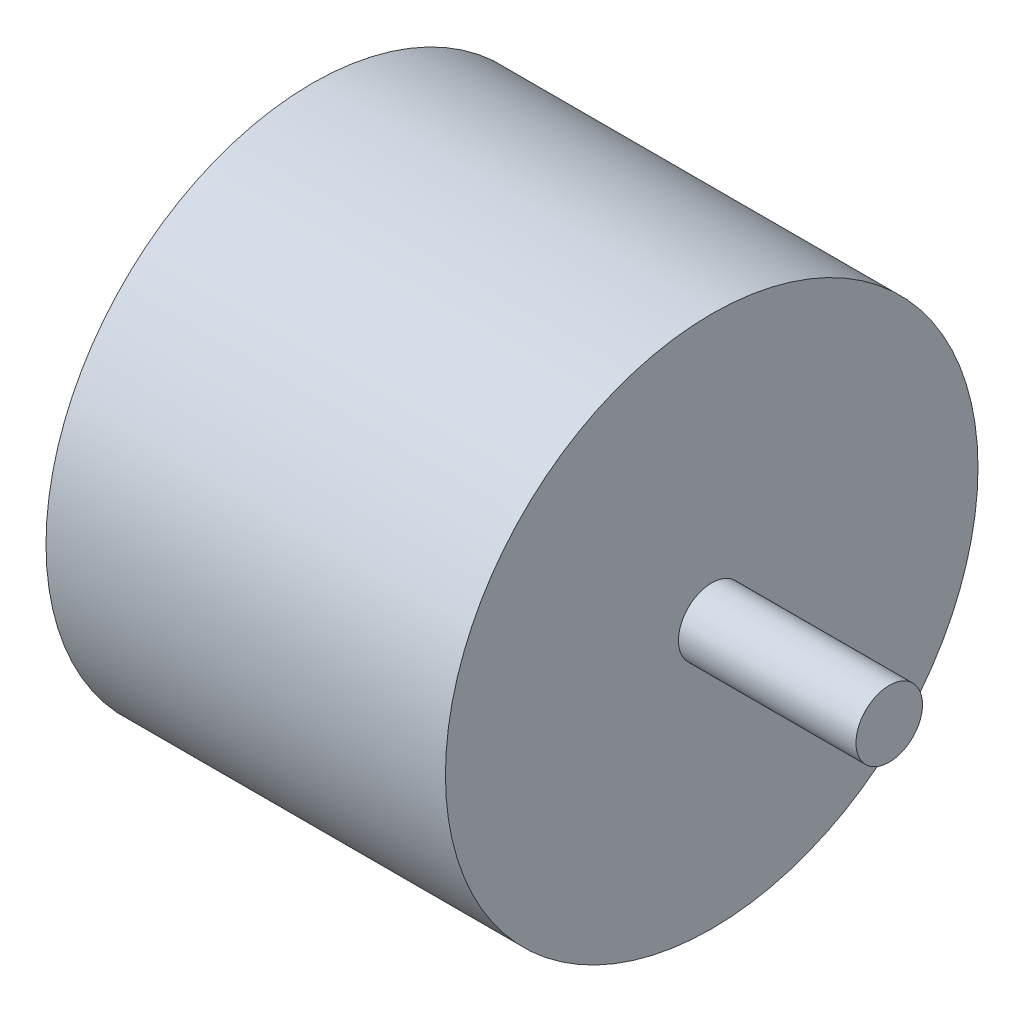
ISO-10303-21;
HEADER;
FILE_DESCRIPTION(('STEP AP214'),'2;1');
FILE_NAME('part.step','',(''),(''),'','','');
FILE_SCHEMA(('AUTOMOTIVE_DESIGN { 1 0 10303 214 1 1 1 1 }'));
ENDSEC;
DATA;
#1=APPLICATION_CONTEXT('core data for automotive mechanical design processes');
#2=APPLICATION_PROTOCOL_DEFINITION('international standard','automotive_design',2000,#1);
#3=PRODUCT_CONTEXT('',#1,'mechanical');
#4=PRODUCT('Part','Part','',(#3));
#5=PRODUCT_RELATED_PRODUCT_CATEGORY('part','',(#4));
#6=PRODUCT_DEFINITION_FORMATION('','',#4);
#7=PRODUCT_DEFINITION_CONTEXT('part definition',#1,'design');
#8=PRODUCT_DEFINITION('design','',#6,#7);
#9=PRODUCT_DEFINITION_SHAPE('','',#8);
#10=(LENGTH_UNIT() NAMED_UNIT(*) SI_UNIT(.MILLI.,.METRE.));
#11=(NAMED_UNIT(*) PLANE_ANGLE_UNIT() SI_UNIT($,.RADIAN.));
#12=(NAMED_UNIT(*) SI_UNIT($,.STERADIAN.) SOLID_ANGLE_UNIT());
#13=UNCERTAINTY_MEASURE_WITH_UNIT(LENGTH_MEASURE(1.E-05),#10,'distance_accuracy_value','');
#14=(GEOMETRIC_REPRESENTATION_CONTEXT(3) GLOBAL_UNCERTAINTY_ASSIGNED_CONTEXT((#13)) GLOBAL_UNIT_ASSIGNED_CONTEXT((#10,
#11,#12)) REPRESENTATION_CONTEXT('',''));
#15=CARTESIAN_POINT('',(0.,0.,0.));
#16=DIRECTION('',(0.,0.,1.));
#17=DIRECTION('',(1.,0.,0.));
#18=AXIS2_PLACEMENT_3D('',#15,#16,#17);
#19=CARTESIAN_POINT('',(18.,0.,0.));
#20=DIRECTION('',(-1.,0.,0.));
#21=DIRECTION('',(0.,0.,1.));
#22=AXIS2_PLACEMENT_3D('',#19,#20,#21);
#23=CYLINDRICAL_SURFACE('',#22,12.);
#24=CARTESIAN_POINT('',(18.,0.,0.));
#25=DIRECTION('',(1.,0.,0.));
#26=DIRECTION('',(0.,0.,-1.));
#27=AXIS2_PLACEMENT_3D('',#24,#25,#26);
#28=CIRCLE('',#27,12.);
#29=CARTESIAN_POINT('',(18.,0.,-12.));
#30=VERTEX_POINT('',#29);
#31=EDGE_CURVE('E10',#30,#30,#28,.T.);
#32=ORIENTED_EDGE('',*,*,#31,.F.);
#33=EDGE_LOOP('',(#32));
#34=FACE_BOUND('',#33,.T.);
#35=CARTESIAN_POINT('',(0.,0.,0.));
#36=DIRECTION('',(1.,0.,0.));
#37=DIRECTION('',(0.,0.,-1.));
#38=AXIS2_PLACEMENT_3D('',#35,#36,#37);
#39=CIRCLE('',#38,12.);
#40=CARTESIAN_POINT('',(0.,0.,-12.));
#41=VERTEX_POINT('',#40);
#42=EDGE_CURVE('E36',#41,#41,#39,.T.);
#43=ORIENTED_EDGE('',*,*,#42,.T.);
#44=EDGE_LOOP('',(#43));
#45=FACE_BOUND('',#44,.T.);
#46=ADVANCED_FACE('F33',(#34,#45),#23,.T.);
#47=CARTESIAN_POINT('',(18.,0.,0.));
#48=DIRECTION('',(1.,0.,0.));
#49=DIRECTION('',(0.,0.,-1.));
#50=AXIS2_PLACEMENT_3D('',#47,#48,#49);
#51=PLANE('',#50);
#52=CARTESIAN_POINT('',(18.,0.,0.));
#53=DIRECTION('',(1.,0.,0.));
#54=DIRECTION('',(0.,0.,-1.));
#55=AXIS2_PLACEMENT_3D('',#52,#53,#54);
#56=CIRCLE('',#55,1.5);
#57=CARTESIAN_POINT('',(18.,0.,-1.5));
#58=VERTEX_POINT('',#57);
#59=EDGE_CURVE('E45',#58,#58,#56,.T.);
#60=ORIENTED_EDGE('',*,*,#59,.F.);
#61=EDGE_LOOP('',(#60));
#62=FACE_BOUND('',#61,.T.);
#63=ORIENTED_EDGE('',*,*,#31,.T.);
#64=EDGE_LOOP('',(#63));
#65=FACE_BOUND('',#64,.T.);
#66=ADVANCED_FACE('F60',(#62,#65),#51,.T.);
#67=CARTESIAN_POINT('',(0.,0.,0.));
#68=DIRECTION('',(1.,0.,0.));
#69=DIRECTION('',(0.,0.,-1.));
#70=AXIS2_PLACEMENT_3D('',#67,#68,#69);
#71=PLANE('',#70);
#72=ORIENTED_EDGE('',*,*,#42,.F.);
#73=EDGE_LOOP('',(#72));
#74=FACE_BOUND('',#73,.T.);
#75=ADVANCED_FACE('F56',(#74),#71,.F.);
#76=CARTESIAN_POINT('',(26.,0.,0.));
#77=DIRECTION('',(-1.,0.,0.));
#78=DIRECTION('',(0.,0.,1.));
#79=AXIS2_PLACEMENT_3D('',#76,#77,#78);
#80=CYLINDRICAL_SURFACE('',#79,1.5);
#81=CARTESIAN_POINT('',(26.,0.,0.));
#82=DIRECTION('',(1.,0.,0.));
#83=DIRECTION('',(0.,0.,-1.));
#84=AXIS2_PLACEMENT_3D('',#81,#82,#83);
#85=CIRCLE('',#84,1.5);
#86=CARTESIAN_POINT('',(26.,0.,-1.5));
#87=VERTEX_POINT('',#86);
#88=EDGE_CURVE('E43',#87,#87,#85,.T.);
#89=ORIENTED_EDGE('',*,*,#88,.F.);
#90=EDGE_LOOP('',(#89));
#91=FACE_BOUND('',#90,.T.);
#92=ORIENTED_EDGE('',*,*,#59,.T.);
#93=EDGE_LOOP('',(#92));
#94=FACE_BOUND('',#93,.T.);
#95=ADVANCED_FACE('F53',(#91,#94),#80,.T.);
#96=CARTESIAN_POINT('',(26.,0.,0.));
#97=DIRECTION('',(1.,0.,0.));
#98=DIRECTION('',(0.,0.,-1.));
#99=AXIS2_PLACEMENT_3D('',#96,#97,#98);
#100=PLANE('',#99);
#101=ORIENTED_EDGE('',*,*,#88,.T.);
#102=EDGE_LOOP('',(#101));
#103=FACE_BOUND('',#102,.T.);
#104=ADVANCED_FACE('F51',(#103),#100,.T.);
#105=CLOSED_SHELL('',(#46,#66,#75,#95,#104));
#106=MANIFOLD_SOLID_BREP('B2',#105);
#107=ADVANCED_BREP_SHAPE_REPRESENTATION('',(#18,#106),#14);
#108=SHAPE_DEFINITION_REPRESENTATION(#9,#107);
ENDSEC;
END-ISO-10303-21;
